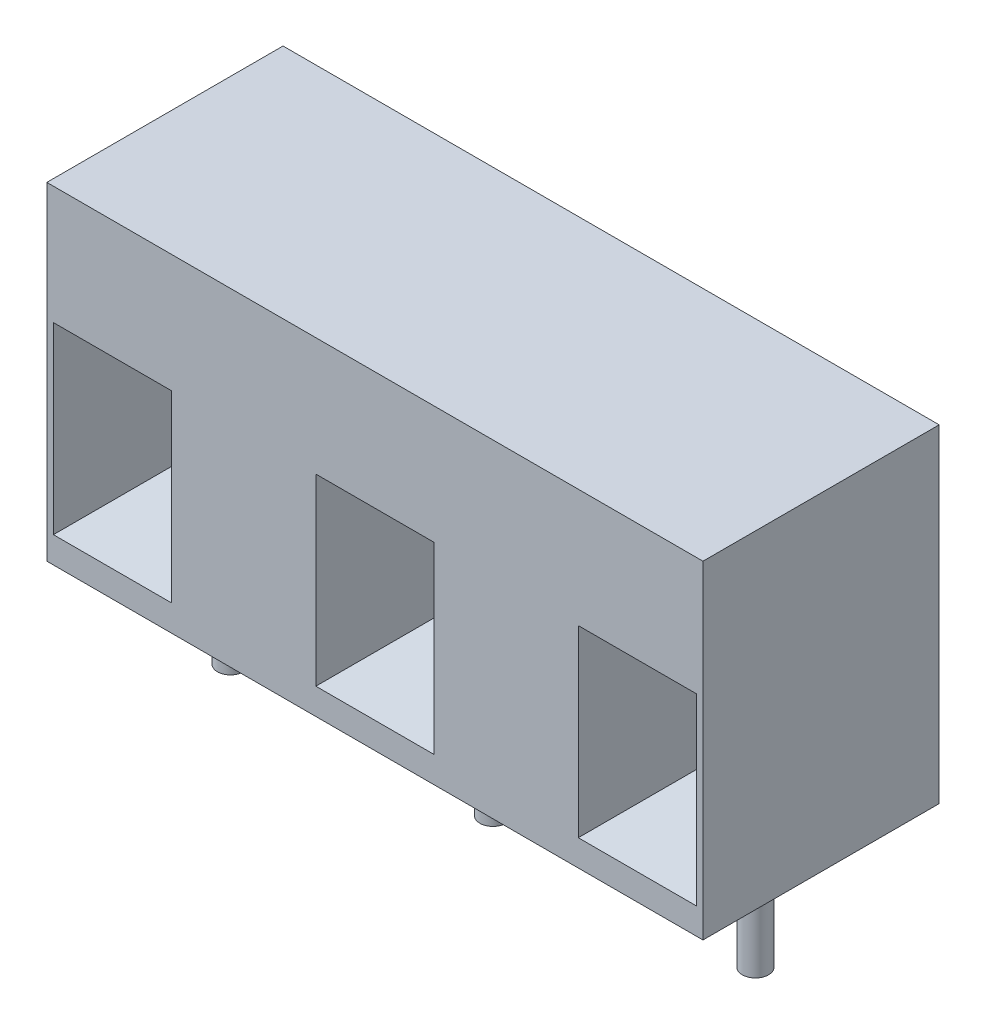
ISO-10303-21;
HEADER;
FILE_DESCRIPTION(('STEP AP214'),'2;1');
FILE_NAME('part.step','',(''),(''),'','','');
FILE_SCHEMA(('AUTOMOTIVE_DESIGN { 1 0 10303 214 1 1 1 1 }'));
ENDSEC;
DATA;
#1=APPLICATION_CONTEXT('core data for automotive mechanical design processes');
#2=APPLICATION_PROTOCOL_DEFINITION('international standard','automotive_design',2000,#1);
#3=PRODUCT_CONTEXT('',#1,'mechanical');
#4=PRODUCT('Part','Part','',(#3));
#5=PRODUCT_RELATED_PRODUCT_CATEGORY('part','',(#4));
#6=PRODUCT_DEFINITION_FORMATION('','',#4);
#7=PRODUCT_DEFINITION_CONTEXT('part definition',#1,'design');
#8=PRODUCT_DEFINITION('design','',#6,#7);
#9=PRODUCT_DEFINITION_SHAPE('','',#8);
#10=(LENGTH_UNIT() NAMED_UNIT(*) SI_UNIT(.MILLI.,.METRE.));
#11=(NAMED_UNIT(*) PLANE_ANGLE_UNIT() SI_UNIT($,.RADIAN.));
#12=(NAMED_UNIT(*) SI_UNIT($,.STERADIAN.) SOLID_ANGLE_UNIT());
#13=UNCERTAINTY_MEASURE_WITH_UNIT(LENGTH_MEASURE(1.E-05),#10,'distance_accuracy_value','');
#14=(GEOMETRIC_REPRESENTATION_CONTEXT(3) GLOBAL_UNCERTAINTY_ASSIGNED_CONTEXT((#13)) GLOBAL_UNIT_ASSIGNED_CONTEXT((#10,
#11,#12)) REPRESENTATION_CONTEXT('',''));
#15=CARTESIAN_POINT('',(0.,0.,0.));
#16=DIRECTION('',(0.,0.,1.));
#17=DIRECTION('',(1.,0.,0.));
#18=AXIS2_PLACEMENT_3D('',#15,#16,#17);
#19=CARTESIAN_POINT('',(12.5,12.5,4.5));
#20=DIRECTION('',(-1.,0.,0.));
#21=DIRECTION('',(0.,0.,1.));
#22=AXIS2_PLACEMENT_3D('',#19,#20,#21);
#23=PLANE('',#22);
#24=DIRECTION('',(0.,0.,-1.));
#25=VECTOR('',#24,1.);
#26=CARTESIAN_POINT('',(12.5,0.,4.5));
#27=LINE('',#26,#25);
#28=CARTESIAN_POINT('',(12.5,0.,4.5));
#29=VERTEX_POINT('',#28);
#30=CARTESIAN_POINT('',(12.5,0.,-4.5));
#31=VERTEX_POINT('',#30);
#32=EDGE_CURVE('E310',#29,#31,#27,.T.);
#33=ORIENTED_EDGE('',*,*,#32,.T.);
#34=DIRECTION('',(0.,-1.,0.));
#35=VECTOR('',#34,1.);
#36=CARTESIAN_POINT('',(12.5,12.5,-4.5));
#37=LINE('',#36,#35);
#38=CARTESIAN_POINT('',(12.5,12.5,-4.5));
#39=VERTEX_POINT('',#38);
#40=EDGE_CURVE('E11',#39,#31,#37,.T.);
#41=ORIENTED_EDGE('',*,*,#40,.F.);
#42=DIRECTION('',(0.,0.,-1.));
#43=VECTOR('',#42,1.);
#44=CARTESIAN_POINT('',(12.5,12.5,4.5));
#45=LINE('',#44,#43);
#46=CARTESIAN_POINT('',(12.5,12.5,4.5));
#47=VERTEX_POINT('',#46);
#48=EDGE_CURVE('E314',#47,#39,#45,.T.);
#49=ORIENTED_EDGE('',*,*,#48,.F.);
#50=DIRECTION('',(0.,-1.,0.));
#51=VECTOR('',#50,1.);
#52=CARTESIAN_POINT('',(12.5,12.5,4.5));
#53=LINE('',#52,#51);
#54=EDGE_CURVE('E328',#47,#29,#53,.T.);
#55=ORIENTED_EDGE('',*,*,#54,.T.);
#56=EDGE_LOOP('',(#33,#41,#49,#55));
#57=FACE_BOUND('',#56,.T.);
#58=ADVANCED_FACE('F39',(#57),#23,.F.);
#59=CARTESIAN_POINT('',(-12.5,12.5,-4.5));
#60=DIRECTION('',(0.,0.,1.));
#61=DIRECTION('',(1.,0.,0.));
#62=AXIS2_PLACEMENT_3D('',#59,#60,#61);
#63=PLANE('',#62);
#64=DIRECTION('',(-1.,0.,0.));
#65=VECTOR('',#64,1.);
#66=CARTESIAN_POINT('',(-12.5,0.,-4.5));
#67=LINE('',#66,#65);
#68=CARTESIAN_POINT('',(-12.5,0.,-4.5));
#69=VERTEX_POINT('',#68);
#70=EDGE_CURVE('E332',#31,#69,#67,.T.);
#71=ORIENTED_EDGE('',*,*,#70,.T.);
#72=DIRECTION('',(0.,-1.,0.));
#73=VECTOR('',#72,1.);
#74=CARTESIAN_POINT('',(-12.5,12.5,-4.5));
#75=LINE('',#74,#73);
#76=CARTESIAN_POINT('',(-12.5,12.5,-4.5));
#77=VERTEX_POINT('',#76);
#78=EDGE_CURVE('E47',#77,#69,#75,.T.);
#79=ORIENTED_EDGE('',*,*,#78,.F.);
#80=DIRECTION('',(-1.,0.,0.));
#81=VECTOR('',#80,1.);
#82=CARTESIAN_POINT('',(-12.5,12.5,-4.5));
#83=LINE('',#82,#81);
#84=EDGE_CURVE('E318',#39,#77,#83,.T.);
#85=ORIENTED_EDGE('',*,*,#84,.F.);
#86=ORIENTED_EDGE('',*,*,#40,.T.);
#87=EDGE_LOOP('',(#71,#79,#85,#86));
#88=FACE_BOUND('',#87,.T.);
#89=ADVANCED_FACE('F367',(#88),#63,.F.);
#90=CARTESIAN_POINT('',(-12.5,12.5,4.5));
#91=DIRECTION('',(1.,0.,0.));
#92=DIRECTION('',(0.,0.,-1.));
#93=AXIS2_PLACEMENT_3D('',#90,#91,#92);
#94=PLANE('',#93);
#95=DIRECTION('',(0.,0.,1.));
#96=VECTOR('',#95,1.);
#97=CARTESIAN_POINT('',(-12.5,0.,4.5));
#98=LINE('',#97,#96);
#99=CARTESIAN_POINT('',(-12.5,0.,4.5));
#100=VERTEX_POINT('',#99);
#101=EDGE_CURVE('E335',#69,#100,#98,.T.);
#102=ORIENTED_EDGE('',*,*,#101,.T.);
#103=DIRECTION('',(0.,-1.,0.));
#104=VECTOR('',#103,1.);
#105=CARTESIAN_POINT('',(-12.5,12.5,4.5));
#106=LINE('',#105,#104);
#107=CARTESIAN_POINT('',(-12.5,12.5,4.5));
#108=VERTEX_POINT('',#107);
#109=EDGE_CURVE('E343',#108,#100,#106,.T.);
#110=ORIENTED_EDGE('',*,*,#109,.F.);
#111=DIRECTION('',(0.,0.,1.));
#112=VECTOR('',#111,1.);
#113=CARTESIAN_POINT('',(-12.5,12.5,4.5));
#114=LINE('',#113,#112);
#115=EDGE_CURVE('E322',#77,#108,#114,.T.);
#116=ORIENTED_EDGE('',*,*,#115,.F.);
#117=ORIENTED_EDGE('',*,*,#78,.T.);
#118=EDGE_LOOP('',(#102,#110,#116,#117));
#119=FACE_BOUND('',#118,.T.);
#120=ADVANCED_FACE('F352',(#119),#94,.F.);
#121=CARTESIAN_POINT('',(-12.5,12.5,4.5));
#122=DIRECTION('',(0.,0.,-1.));
#123=DIRECTION('',(-1.,0.,0.));
#124=AXIS2_PLACEMENT_3D('',#121,#122,#123);
#125=PLANE('',#124);
#126=DIRECTION('',(-1.,0.,0.));
#127=VECTOR('',#126,1.);
#128=CARTESIAN_POINT('',(-12.25,8.,4.5));
#129=LINE('',#128,#127);
#130=CARTESIAN_POINT('',(-7.75,8.,4.5));
#131=VERTEX_POINT('',#130);
#132=CARTESIAN_POINT('',(-12.25,8.,4.5));
#133=VERTEX_POINT('',#132);
#134=EDGE_CURVE('E206',#131,#133,#129,.T.);
#135=ORIENTED_EDGE('',*,*,#134,.F.);
#136=DIRECTION('',(0.,1.,0.));
#137=VECTOR('',#136,1.);
#138=CARTESIAN_POINT('',(-7.75,1.,4.5));
#139=LINE('',#138,#137);
#140=CARTESIAN_POINT('',(-7.75,1.,4.5));
#141=VERTEX_POINT('',#140);
#142=EDGE_CURVE('E54',#141,#131,#139,.T.);
#143=ORIENTED_EDGE('',*,*,#142,.F.);
#144=DIRECTION('',(1.,0.,0.));
#145=VECTOR('',#144,1.);
#146=CARTESIAN_POINT('',(-12.25,1.,4.5));
#147=LINE('',#146,#145);
#148=CARTESIAN_POINT('',(-12.25,1.,4.5));
#149=VERTEX_POINT('',#148);
#150=EDGE_CURVE('E214',#149,#141,#147,.T.);
#151=ORIENTED_EDGE('',*,*,#150,.F.);
#152=DIRECTION('',(0.,-1.,0.));
#153=VECTOR('',#152,1.);
#154=CARTESIAN_POINT('',(-12.25,1.,4.5));
#155=LINE('',#154,#153);
#156=EDGE_CURVE('E210',#133,#149,#155,.T.);
#157=ORIENTED_EDGE('',*,*,#156,.F.);
#158=EDGE_LOOP('',(#135,#143,#151,#157));
#159=FACE_BOUND('',#158,.T.);
#160=DIRECTION('',(-1.,0.,0.));
#161=VECTOR('',#160,1.);
#162=CARTESIAN_POINT('',(7.75,8.,4.5));
#163=LINE('',#162,#161);
#164=CARTESIAN_POINT('',(12.25,8.,4.5));
#165=VERTEX_POINT('',#164);
#166=CARTESIAN_POINT('',(7.75,8.,4.5));
#167=VERTEX_POINT('',#166);
#168=EDGE_CURVE('E168',#165,#167,#163,.T.);
#169=ORIENTED_EDGE('',*,*,#168,.F.);
#170=DIRECTION('',(0.,1.,0.));
#171=VECTOR('',#170,1.);
#172=CARTESIAN_POINT('',(12.25,0.999999999999998,4.5));
#173=LINE('',#172,#171);
#174=CARTESIAN_POINT('',(12.25,0.999999999999998,4.5));
#175=VERTEX_POINT('',#174);
#176=EDGE_CURVE('E62',#175,#165,#173,.T.);
#177=ORIENTED_EDGE('',*,*,#176,.F.);
#178=DIRECTION('',(1.,0.,0.));
#179=VECTOR('',#178,1.);
#180=CARTESIAN_POINT('',(7.75,0.999999999999998,4.5));
#181=LINE('',#180,#179);
#182=CARTESIAN_POINT('',(7.75,0.999999999999998,4.5));
#183=VERTEX_POINT('',#182);
#184=EDGE_CURVE('E176',#183,#175,#181,.T.);
#185=ORIENTED_EDGE('',*,*,#184,.F.);
#186=DIRECTION('',(0.,-1.,0.));
#187=VECTOR('',#186,1.);
#188=CARTESIAN_POINT('',(7.75,0.999999999999998,4.5));
#189=LINE('',#188,#187);
#190=EDGE_CURVE('E156',#167,#183,#189,.T.);
#191=ORIENTED_EDGE('',*,*,#190,.F.);
#192=EDGE_LOOP('',(#169,#177,#185,#191));
#193=FACE_BOUND('',#192,.T.);
#194=DIRECTION('',(-1.,0.,0.));
#195=VECTOR('',#194,1.);
#196=CARTESIAN_POINT('',(-2.25000000000001,8.,4.5));
#197=LINE('',#196,#195);
#198=CARTESIAN_POINT('',(2.24999999999999,8.,4.5));
#199=VERTEX_POINT('',#198);
#200=CARTESIAN_POINT('',(-2.25000000000001,8.,4.5));
#201=VERTEX_POINT('',#200);
#202=EDGE_CURVE('E248',#199,#201,#197,.T.);
#203=ORIENTED_EDGE('',*,*,#202,.F.);
#204=DIRECTION('',(0.,1.,0.));
#205=VECTOR('',#204,1.);
#206=CARTESIAN_POINT('',(2.24999999999999,0.999999999999999,4.5));
#207=LINE('',#206,#205);
#208=CARTESIAN_POINT('',(2.24999999999999,0.999999999999999,4.5));
#209=VERTEX_POINT('',#208);
#210=EDGE_CURVE('E187',#209,#199,#207,.T.);
#211=ORIENTED_EDGE('',*,*,#210,.F.);
#212=DIRECTION('',(1.,0.,0.));
#213=VECTOR('',#212,1.);
#214=CARTESIAN_POINT('',(-2.25,0.999999999999999,4.5));
#215=LINE('',#214,#213);
#216=CARTESIAN_POINT('',(-2.25,0.999999999999999,4.5));
#217=VERTEX_POINT('',#216);
#218=EDGE_CURVE('E256',#217,#209,#215,.T.);
#219=ORIENTED_EDGE('',*,*,#218,.F.);
#220=DIRECTION('',(0.,-1.,0.));
#221=VECTOR('',#220,1.);
#222=CARTESIAN_POINT('',(-2.25,0.999999999999999,4.5));
#223=LINE('',#222,#221);
#224=EDGE_CURVE('E252',#201,#217,#223,.T.);
#225=ORIENTED_EDGE('',*,*,#224,.F.);
#226=EDGE_LOOP('',(#203,#211,#219,#225));
#227=FACE_BOUND('',#226,.T.);
#228=DIRECTION('',(1.,0.,0.));
#229=VECTOR('',#228,1.);
#230=CARTESIAN_POINT('',(-12.5,0.,4.5));
#231=LINE('',#230,#229);
#232=EDGE_CURVE('E319',#100,#29,#231,.T.);
#233=ORIENTED_EDGE('',*,*,#232,.T.);
#234=ORIENTED_EDGE('',*,*,#54,.F.);
#235=DIRECTION('',(1.,0.,0.));
#236=VECTOR('',#235,1.);
#237=CARTESIAN_POINT('',(-12.5,12.5,4.5));
#238=LINE('',#237,#236);
#239=EDGE_CURVE('E325',#108,#47,#238,.T.);
#240=ORIENTED_EDGE('',*,*,#239,.F.);
#241=ORIENTED_EDGE('',*,*,#109,.T.);
#242=EDGE_LOOP('',(#233,#234,#240,#241));
#243=FACE_BOUND('',#242,.T.);
#244=ADVANCED_FACE('F173',(#159,#193,#227,#243),#125,.F.);
#245=CARTESIAN_POINT('',(0.,12.5,0.));
#246=DIRECTION('',(0.,-1.,0.));
#247=DIRECTION('',(0.,0.,-1.));
#248=AXIS2_PLACEMENT_3D('',#245,#246,#247);
#249=PLANE('',#248);
#250=ORIENTED_EDGE('',*,*,#48,.T.);
#251=ORIENTED_EDGE('',*,*,#84,.T.);
#252=ORIENTED_EDGE('',*,*,#115,.T.);
#253=ORIENTED_EDGE('',*,*,#239,.T.);
#254=EDGE_LOOP('',(#250,#251,#252,#253));
#255=FACE_BOUND('',#254,.T.);
#256=ADVANCED_FACE('F366',(#255),#249,.F.);
#257=CARTESIAN_POINT('',(0.,0.,0.));
#258=DIRECTION('',(0.,-1.,0.));
#259=DIRECTION('',(0.,0.,-1.));
#260=AXIS2_PLACEMENT_3D('',#257,#258,#259);
#261=PLANE('',#260);
#262=CARTESIAN_POINT('',(10.,0.,0.));
#263=DIRECTION('',(0.,-1.,0.));
#264=DIRECTION('',(0.,0.,-1.));
#265=AXIS2_PLACEMENT_3D('',#262,#263,#264);
#266=CIRCLE('',#265,0.500000000000001);
#267=CARTESIAN_POINT('',(10.,0.,-0.500000000000001));
#268=VERTEX_POINT('',#267);
#269=EDGE_CURVE('E264',#268,#268,#266,.T.);
#270=ORIENTED_EDGE('',*,*,#269,.F.);
#271=EDGE_LOOP('',(#270));
#272=FACE_BOUND('',#271,.T.);
#273=CARTESIAN_POINT('',(-10.,0.,0.));
#274=DIRECTION('',(0.,-1.,0.));
#275=DIRECTION('',(0.,0.,-1.));
#276=AXIS2_PLACEMENT_3D('',#273,#274,#275);
#277=CIRCLE('',#276,0.500000000000001);
#278=CARTESIAN_POINT('',(-10.,0.,-0.500000000000001));
#279=VERTEX_POINT('',#278);
#280=EDGE_CURVE('E294',#279,#279,#277,.T.);
#281=ORIENTED_EDGE('',*,*,#280,.F.);
#282=EDGE_LOOP('',(#281));
#283=FACE_BOUND('',#282,.T.);
#284=CARTESIAN_POINT('',(0.,0.,0.));
#285=DIRECTION('',(0.,-1.,0.));
#286=DIRECTION('',(0.,0.,-1.));
#287=AXIS2_PLACEMENT_3D('',#284,#285,#286);
#288=CIRCLE('',#287,0.5);
#289=CARTESIAN_POINT('',(0.,0.,-0.5));
#290=VERTEX_POINT('',#289);
#291=EDGE_CURVE('E302',#290,#290,#288,.T.);
#292=ORIENTED_EDGE('',*,*,#291,.F.);
#293=EDGE_LOOP('',(#292));
#294=FACE_BOUND('',#293,.T.);
#295=ORIENTED_EDGE('',*,*,#32,.F.);
#296=ORIENTED_EDGE('',*,*,#232,.F.);
#297=ORIENTED_EDGE('',*,*,#101,.F.);
#298=ORIENTED_EDGE('',*,*,#70,.F.);
#299=EDGE_LOOP('',(#295,#296,#297,#298));
#300=FACE_BOUND('',#299,.T.);
#301=ADVANCED_FACE('F358',(#272,#283,#294,#300),#261,.T.);
#302=CARTESIAN_POINT('',(0.,-4.4,0.));
#303=DIRECTION('',(0.,1.,0.));
#304=DIRECTION('',(0.,0.,1.));
#305=AXIS2_PLACEMENT_3D('',#302,#303,#304);
#306=CYLINDRICAL_SURFACE('',#305,0.5);
#307=CARTESIAN_POINT('',(0.,-4.4,0.));
#308=DIRECTION('',(0.,-1.,0.));
#309=DIRECTION('',(0.,0.,-1.));
#310=AXIS2_PLACEMENT_3D('',#307,#308,#309);
#311=CIRCLE('',#310,0.5);
#312=CARTESIAN_POINT('',(0.,-4.4,-0.5));
#313=VERTEX_POINT('',#312);
#314=EDGE_CURVE('E306',#313,#313,#311,.T.);
#315=ORIENTED_EDGE('',*,*,#314,.F.);
#316=EDGE_LOOP('',(#315));
#317=FACE_BOUND('',#316,.T.);
#318=ORIENTED_EDGE('',*,*,#291,.T.);
#319=EDGE_LOOP('',(#318));
#320=FACE_BOUND('',#319,.T.);
#321=ADVANCED_FACE('F380',(#317,#320),#306,.T.);
#322=CARTESIAN_POINT('',(0.,-4.4,0.));
#323=DIRECTION('',(0.,-1.,0.));
#324=DIRECTION('',(0.,0.,-1.));
#325=AXIS2_PLACEMENT_3D('',#322,#323,#324);
#326=PLANE('',#325);
#327=ORIENTED_EDGE('',*,*,#314,.T.);
#328=EDGE_LOOP('',(#327));
#329=FACE_BOUND('',#328,.T.);
#330=ADVANCED_FACE('F386',(#329),#326,.T.);
#331=CARTESIAN_POINT('',(-10.,-4.4,0.));
#332=DIRECTION('',(0.,1.,0.));
#333=DIRECTION('',(0.,0.,1.));
#334=AXIS2_PLACEMENT_3D('',#331,#332,#333);
#335=CYLINDRICAL_SURFACE('',#334,0.500000000000001);
#336=CARTESIAN_POINT('',(-10.,-4.4,0.));
#337=DIRECTION('',(0.,-1.,0.));
#338=DIRECTION('',(0.,0.,-1.));
#339=AXIS2_PLACEMENT_3D('',#336,#337,#338);
#340=CIRCLE('',#339,0.500000000000001);
#341=CARTESIAN_POINT('',(-10.,-4.4,-0.500000000000001));
#342=VERTEX_POINT('',#341);
#343=EDGE_CURVE('E298',#342,#342,#340,.T.);
#344=ORIENTED_EDGE('',*,*,#343,.F.);
#345=EDGE_LOOP('',(#344));
#346=FACE_BOUND('',#345,.T.);
#347=ORIENTED_EDGE('',*,*,#280,.T.);
#348=EDGE_LOOP('',(#347));
#349=FACE_BOUND('',#348,.T.);
#350=ADVANCED_FACE('F390',(#346,#349),#335,.T.);
#351=CARTESIAN_POINT('',(-10.,-4.4,0.));
#352=DIRECTION('',(0.,-1.,0.));
#353=DIRECTION('',(0.,0.,-1.));
#354=AXIS2_PLACEMENT_3D('',#351,#352,#353);
#355=PLANE('',#354);
#356=ORIENTED_EDGE('',*,*,#343,.T.);
#357=EDGE_LOOP('',(#356));
#358=FACE_BOUND('',#357,.T.);
#359=ADVANCED_FACE('F394',(#358),#355,.T.);
#360=CARTESIAN_POINT('',(10.,-4.4,0.));
#361=DIRECTION('',(0.,1.,0.));
#362=DIRECTION('',(0.,0.,1.));
#363=AXIS2_PLACEMENT_3D('',#360,#361,#362);
#364=CYLINDRICAL_SURFACE('',#363,0.500000000000001);
#365=CARTESIAN_POINT('',(10.,-4.4,0.));
#366=DIRECTION('',(0.,-1.,0.));
#367=DIRECTION('',(0.,0.,-1.));
#368=AXIS2_PLACEMENT_3D('',#365,#366,#367);
#369=CIRCLE('',#368,0.500000000000001);
#370=CARTESIAN_POINT('',(10.,-4.4,-0.500000000000001));
#371=VERTEX_POINT('',#370);
#372=EDGE_CURVE('E290',#371,#371,#369,.T.);
#373=ORIENTED_EDGE('',*,*,#372,.F.);
#374=EDGE_LOOP('',(#373));
#375=FACE_BOUND('',#374,.T.);
#376=ORIENTED_EDGE('',*,*,#269,.T.);
#377=EDGE_LOOP('',(#376));
#378=FACE_BOUND('',#377,.T.);
#379=ADVANCED_FACE('F398',(#375,#378),#364,.T.);
#380=CARTESIAN_POINT('',(10.,-4.4,0.));
#381=DIRECTION('',(0.,-1.,0.));
#382=DIRECTION('',(0.,0.,-1.));
#383=AXIS2_PLACEMENT_3D('',#380,#381,#382);
#384=PLANE('',#383);
#385=ORIENTED_EDGE('',*,*,#372,.T.);
#386=EDGE_LOOP('',(#385));
#387=FACE_BOUND('',#386,.T.);
#388=ADVANCED_FACE('F402',(#387),#384,.T.);
#389=CARTESIAN_POINT('',(2.24999999999999,0.999999999999999,4.5));
#390=DIRECTION('',(0.965925826289068,0.,-0.258819045102521));
#391=DIRECTION('',(-0.258819045102521,0.,-0.965925826289068));
#392=AXIS2_PLACEMENT_3D('',#389,#390,#391);
#393=PLANE('',#392);
#394=ORIENTED_EDGE('',*,*,#210,.T.);
#395=DIRECTION('',(0.250562807085732,0.250562807085732,0.935113126531029));
#396=VECTOR('',#395,1.);
#397=CARTESIAN_POINT('',(1.81052795793722,7.56052795793723,2.85986801051569));
#398=LINE('',#397,#396);
#399=CARTESIAN_POINT('',(1.07102355330305,6.82102355330306,0.1));
#400=VERTEX_POINT('',#399);
#401=EDGE_CURVE('E266',#400,#199,#398,.T.);
#402=ORIENTED_EDGE('',*,*,#401,.F.);
#403=DIRECTION('',(0.,1.,0.));
#404=VECTOR('',#403,1.);
#405=CARTESIAN_POINT('',(1.07102355330305,0.999999999999999,0.1));
#406=LINE('',#405,#404);
#407=CARTESIAN_POINT('',(1.07102355330305,2.17897644669694,0.1));
#408=VERTEX_POINT('',#407);
#409=EDGE_CURVE('E260',#408,#400,#406,.T.);
#410=ORIENTED_EDGE('',*,*,#409,.F.);
#411=DIRECTION('',(0.250562807085732,-0.250562807085732,0.935113126531029));
#412=VECTOR('',#411,1.);
#413=CARTESIAN_POINT('',(1.96748225867393,1.28251774132607,3.44562943533152));
#414=LINE('',#413,#412);
#415=EDGE_CURVE('E261',#408,#209,#414,.T.);
#416=ORIENTED_EDGE('',*,*,#415,.T.);
#417=EDGE_LOOP('',(#394,#402,#410,#416));
#418=FACE_BOUND('',#417,.T.);
#419=ADVANCED_FACE('F406',(#418),#393,.F.);
#420=CARTESIAN_POINT('',(-2.25,0.999999999999999,4.5));
#421=DIRECTION('',(0.,-0.965925826289068,-0.258819045102521));
#422=DIRECTION('',(0.,0.258819045102521,-0.965925826289068));
#423=AXIS2_PLACEMENT_3D('',#420,#421,#422);
#424=PLANE('',#423);
#425=ORIENTED_EDGE('',*,*,#218,.T.);
#426=ORIENTED_EDGE('',*,*,#415,.F.);
#427=DIRECTION('',(1.,0.,0.));
#428=VECTOR('',#427,1.);
#429=CARTESIAN_POINT('',(-2.25,2.17897644669694,0.1));
#430=LINE('',#429,#428);
#431=CARTESIAN_POINT('',(-1.07102355330306,2.17897644669694,0.1));
#432=VERTEX_POINT('',#431);
#433=EDGE_CURVE('E271',#432,#408,#430,.T.);
#434=ORIENTED_EDGE('',*,*,#433,.F.);
#435=DIRECTION('',(-0.250562807085732,-0.250562807085732,0.935113126531029));
#436=VECTOR('',#435,1.);
#437=CARTESIAN_POINT('',(-2.25,0.999999999999999,4.5));
#438=LINE('',#437,#436);
#439=EDGE_CURVE('E265',#432,#217,#438,.T.);
#440=ORIENTED_EDGE('',*,*,#439,.T.);
#441=EDGE_LOOP('',(#425,#426,#434,#440));
#442=FACE_BOUND('',#441,.T.);
#443=ADVANCED_FACE('F408',(#442),#424,.F.);
#444=CARTESIAN_POINT('',(-2.25,0.999999999999999,4.5));
#445=DIRECTION('',(-0.965925826289068,0.,-0.258819045102521));
#446=DIRECTION('',(-0.258819045102521,0.,0.965925826289068));
#447=AXIS2_PLACEMENT_3D('',#444,#445,#446);
#448=PLANE('',#447);
#449=ORIENTED_EDGE('',*,*,#224,.T.);
#450=ORIENTED_EDGE('',*,*,#439,.F.);
#451=DIRECTION('',(0.,-1.,0.));
#452=VECTOR('',#451,1.);
#453=CARTESIAN_POINT('',(-1.07102355330306,0.999999999999999,0.1));
#454=LINE('',#453,#452);
#455=CARTESIAN_POINT('',(-1.07102355330306,6.82102355330306,0.1));
#456=VERTEX_POINT('',#455);
#457=EDGE_CURVE('E283',#456,#432,#454,.T.);
#458=ORIENTED_EDGE('',*,*,#457,.F.);
#459=DIRECTION('',(-0.250562807085732,0.250562807085732,0.935113126531029));
#460=VECTOR('',#459,1.);
#461=CARTESIAN_POINT('',(-2.25000000000001,8.,4.5));
#462=LINE('',#461,#460);
#463=EDGE_CURVE('E270',#456,#201,#462,.T.);
#464=ORIENTED_EDGE('',*,*,#463,.T.);
#465=EDGE_LOOP('',(#449,#450,#458,#464));
#466=FACE_BOUND('',#465,.T.);
#467=ADVANCED_FACE('F411',(#466),#448,.F.);
#468=CARTESIAN_POINT('',(-2.25000000000001,8.,4.5));
#469=DIRECTION('',(0.,0.965925826289068,-0.258819045102521));
#470=DIRECTION('',(0.,0.258819045102521,0.965925826289068));
#471=AXIS2_PLACEMENT_3D('',#468,#469,#470);
#472=PLANE('',#471);
#473=ORIENTED_EDGE('',*,*,#202,.T.);
#474=ORIENTED_EDGE('',*,*,#463,.F.);
#475=DIRECTION('',(-1.,0.,0.));
#476=VECTOR('',#475,1.);
#477=CARTESIAN_POINT('',(-2.25000000000001,6.82102355330306,0.1));
#478=LINE('',#477,#476);
#479=EDGE_CURVE('E279',#400,#456,#478,.T.);
#480=ORIENTED_EDGE('',*,*,#479,.F.);
#481=ORIENTED_EDGE('',*,*,#401,.T.);
#482=EDGE_LOOP('',(#473,#474,#480,#481));
#483=FACE_BOUND('',#482,.T.);
#484=ADVANCED_FACE('F415',(#483),#472,.F.);
#485=CARTESIAN_POINT('',(0.,0.,0.1));
#486=DIRECTION('',(0.,0.,-1.));
#487=DIRECTION('',(-1.,0.,0.));
#488=AXIS2_PLACEMENT_3D('',#485,#486,#487);
#489=PLANE('',#488);
#490=ORIENTED_EDGE('',*,*,#409,.T.);
#491=ORIENTED_EDGE('',*,*,#479,.T.);
#492=ORIENTED_EDGE('',*,*,#457,.T.);
#493=ORIENTED_EDGE('',*,*,#433,.T.);
#494=EDGE_LOOP('',(#490,#491,#492,#493));
#495=FACE_BOUND('',#494,.T.);
#496=ADVANCED_FACE('F419',(#495),#489,.F.);
#497=CARTESIAN_POINT('',(12.25,0.999999999999998,4.5));
#498=DIRECTION('',(0.965925826289068,0.,-0.258819045102521));
#499=DIRECTION('',(-0.258819045102521,0.,-0.965925826289068));
#500=AXIS2_PLACEMENT_3D('',#497,#498,#499);
#501=PLANE('',#500);
#502=ORIENTED_EDGE('',*,*,#176,.T.);
#503=DIRECTION('',(0.250562807085732,0.250562807085732,0.935113126531029));
#504=VECTOR('',#503,1.);
#505=CARTESIAN_POINT('',(11.8105279579372,7.56052795793723,2.85986801051569));
#506=LINE('',#505,#504);
#507=CARTESIAN_POINT('',(11.0710235533031,6.82102355330306,0.1));
#508=VERTEX_POINT('',#507);
#509=EDGE_CURVE('E165',#508,#165,#506,.T.);
#510=ORIENTED_EDGE('',*,*,#509,.F.);
#511=DIRECTION('',(0.,1.,0.));
#512=VECTOR('',#511,1.);
#513=CARTESIAN_POINT('',(11.0710235533031,0.999999999999998,0.1));
#514=LINE('',#513,#512);
#515=CARTESIAN_POINT('',(11.0710235533031,2.17897644669694,0.1));
#516=VERTEX_POINT('',#515);
#517=EDGE_CURVE('E180',#516,#508,#514,.T.);
#518=ORIENTED_EDGE('',*,*,#517,.F.);
#519=DIRECTION('',(0.250562807085732,-0.250562807085732,0.935113126531029));
#520=VECTOR('',#519,1.);
#521=CARTESIAN_POINT('',(11.9674822586739,1.28251774132607,3.44562943533152));
#522=LINE('',#521,#520);
#523=EDGE_CURVE('E184',#516,#175,#522,.T.);
#524=ORIENTED_EDGE('',*,*,#523,.T.);
#525=EDGE_LOOP('',(#502,#510,#518,#524));
#526=FACE_BOUND('',#525,.T.);
#527=ADVANCED_FACE('F426',(#526),#501,.F.);
#528=CARTESIAN_POINT('',(7.75,0.999999999999998,4.5));
#529=DIRECTION('',(0.,-0.965925826289068,-0.258819045102521));
#530=DIRECTION('',(0.,0.258819045102521,-0.965925826289068));
#531=AXIS2_PLACEMENT_3D('',#528,#529,#530);
#532=PLANE('',#531);
#533=ORIENTED_EDGE('',*,*,#184,.T.);
#534=ORIENTED_EDGE('',*,*,#523,.F.);
#535=DIRECTION('',(1.,0.,0.));
#536=VECTOR('',#535,1.);
#537=CARTESIAN_POINT('',(7.75,2.17897644669694,0.1));
#538=LINE('',#537,#536);
#539=CARTESIAN_POINT('',(8.92897644669694,2.17897644669694,0.1));
#540=VERTEX_POINT('',#539);
#541=EDGE_CURVE('E189',#540,#516,#538,.T.);
#542=ORIENTED_EDGE('',*,*,#541,.F.);
#543=DIRECTION('',(-0.250562807085732,-0.250562807085732,0.935113126531029));
#544=VECTOR('',#543,1.);
#545=CARTESIAN_POINT('',(7.75,0.999999999999998,4.5));
#546=LINE('',#545,#544);
#547=EDGE_CURVE('E164',#540,#183,#546,.T.);
#548=ORIENTED_EDGE('',*,*,#547,.T.);
#549=EDGE_LOOP('',(#533,#534,#542,#548));
#550=FACE_BOUND('',#549,.T.);
#551=ADVANCED_FACE('F448',(#550),#532,.F.);
#552=CARTESIAN_POINT('',(7.75,0.999999999999998,4.5));
#553=DIRECTION('',(-0.965925826289068,0.,-0.258819045102521));
#554=DIRECTION('',(-0.258819045102521,0.,0.965925826289068));
#555=AXIS2_PLACEMENT_3D('',#552,#553,#554);
#556=PLANE('',#555);
#557=ORIENTED_EDGE('',*,*,#190,.T.);
#558=ORIENTED_EDGE('',*,*,#547,.F.);
#559=DIRECTION('',(0.,-1.,0.));
#560=VECTOR('',#559,1.);
#561=CARTESIAN_POINT('',(8.92897644669694,0.999999999999999,0.1));
#562=LINE('',#561,#560);
#563=CARTESIAN_POINT('',(8.92897644669694,6.82102355330306,0.1));
#564=VERTEX_POINT('',#563);
#565=EDGE_CURVE('E159',#564,#540,#562,.T.);
#566=ORIENTED_EDGE('',*,*,#565,.F.);
#567=DIRECTION('',(-0.250562807085732,0.250562807085732,0.935113126531029));
#568=VECTOR('',#567,1.);
#569=CARTESIAN_POINT('',(7.75,8.,4.5));
#570=LINE('',#569,#568);
#571=EDGE_CURVE('E152',#564,#167,#570,.T.);
#572=ORIENTED_EDGE('',*,*,#571,.T.);
#573=EDGE_LOOP('',(#557,#558,#566,#572));
#574=FACE_BOUND('',#573,.T.);
#575=ADVANCED_FACE('F154',(#574),#556,.F.);
#576=CARTESIAN_POINT('',(7.75,8.,4.5));
#577=DIRECTION('',(0.,0.965925826289068,-0.258819045102521));
#578=DIRECTION('',(0.,0.258819045102521,0.965925826289068));
#579=AXIS2_PLACEMENT_3D('',#576,#577,#578);
#580=PLANE('',#579);
#581=ORIENTED_EDGE('',*,*,#168,.T.);
#582=ORIENTED_EDGE('',*,*,#571,.F.);
#583=DIRECTION('',(-1.,0.,0.));
#584=VECTOR('',#583,1.);
#585=CARTESIAN_POINT('',(7.75,6.82102355330306,0.1));
#586=LINE('',#585,#584);
#587=EDGE_CURVE('E196',#508,#564,#586,.T.);
#588=ORIENTED_EDGE('',*,*,#587,.F.);
#589=ORIENTED_EDGE('',*,*,#509,.T.);
#590=EDGE_LOOP('',(#581,#582,#588,#589));
#591=FACE_BOUND('',#590,.T.);
#592=ADVANCED_FACE('F169',(#591),#580,.F.);
#593=CARTESIAN_POINT('',(0.,0.,0.1));
#594=DIRECTION('',(0.,0.,-1.));
#595=DIRECTION('',(-1.,0.,0.));
#596=AXIS2_PLACEMENT_3D('',#593,#594,#595);
#597=PLANE('',#596);
#598=ORIENTED_EDGE('',*,*,#517,.T.);
#599=ORIENTED_EDGE('',*,*,#587,.T.);
#600=ORIENTED_EDGE('',*,*,#565,.T.);
#601=ORIENTED_EDGE('',*,*,#541,.T.);
#602=EDGE_LOOP('',(#598,#599,#600,#601));
#603=FACE_BOUND('',#602,.T.);
#604=ADVANCED_FACE('F444',(#603),#597,.F.);
#605=CARTESIAN_POINT('',(-7.75,1.,4.5));
#606=DIRECTION('',(0.965925826289068,0.,-0.258819045102521));
#607=DIRECTION('',(-0.258819045102521,0.,-0.965925826289068));
#608=AXIS2_PLACEMENT_3D('',#605,#606,#607);
#609=PLANE('',#608);
#610=ORIENTED_EDGE('',*,*,#142,.T.);
#611=DIRECTION('',(0.250562807085732,0.250562807085732,0.935113126531029));
#612=VECTOR('',#611,1.);
#613=CARTESIAN_POINT('',(-8.18947204206277,7.56052795793723,2.85986801051569));
#614=LINE('',#613,#612);
#615=CARTESIAN_POINT('',(-8.92897644669694,6.82102355330306,0.1));
#616=VERTEX_POINT('',#615);
#617=EDGE_CURVE('E223',#616,#131,#614,.T.);
#618=ORIENTED_EDGE('',*,*,#617,.F.);
#619=DIRECTION('',(0.,1.,0.));
#620=VECTOR('',#619,1.);
#621=CARTESIAN_POINT('',(-8.92897644669694,1.,0.1));
#622=LINE('',#621,#620);
#623=CARTESIAN_POINT('',(-8.92897644669694,2.17897644669694,0.1));
#624=VERTEX_POINT('',#623);
#625=EDGE_CURVE('E218',#624,#616,#622,.T.);
#626=ORIENTED_EDGE('',*,*,#625,.F.);
#627=DIRECTION('',(0.250562807085732,-0.250562807085732,0.935113126531029));
#628=VECTOR('',#627,1.);
#629=CARTESIAN_POINT('',(-8.03251774132607,1.28251774132607,3.44562943533151));
#630=LINE('',#629,#628);
#631=EDGE_CURVE('E219',#624,#141,#630,.T.);
#632=ORIENTED_EDGE('',*,*,#631,.T.);
#633=EDGE_LOOP('',(#610,#618,#626,#632));
#634=FACE_BOUND('',#633,.T.);
#635=ADVANCED_FACE('F432',(#634),#609,.F.);
#636=CARTESIAN_POINT('',(-12.25,1.,4.5));
#637=DIRECTION('',(0.,-0.965925826289068,-0.258819045102521));
#638=DIRECTION('',(0.,0.258819045102521,-0.965925826289068));
#639=AXIS2_PLACEMENT_3D('',#636,#637,#638);
#640=PLANE('',#639);
#641=ORIENTED_EDGE('',*,*,#150,.T.);
#642=ORIENTED_EDGE('',*,*,#631,.F.);
#643=DIRECTION('',(1.,0.,0.));
#644=VECTOR('',#643,1.);
#645=CARTESIAN_POINT('',(-12.25,2.17897644669694,0.1));
#646=LINE('',#645,#644);
#647=CARTESIAN_POINT('',(-11.0710235533031,2.17897644669694,0.1));
#648=VERTEX_POINT('',#647);
#649=EDGE_CURVE('E227',#648,#624,#646,.T.);
#650=ORIENTED_EDGE('',*,*,#649,.F.);
#651=DIRECTION('',(-0.250562807085732,-0.250562807085732,0.935113126531029));
#652=VECTOR('',#651,1.);
#653=CARTESIAN_POINT('',(-12.25,1.,4.5));
#654=LINE('',#653,#652);
#655=EDGE_CURVE('E222',#648,#149,#654,.T.);
#656=ORIENTED_EDGE('',*,*,#655,.T.);
#657=EDGE_LOOP('',(#641,#642,#650,#656));
#658=FACE_BOUND('',#657,.T.);
#659=ADVANCED_FACE('F428',(#658),#640,.F.);
#660=CARTESIAN_POINT('',(-12.25,1.,4.5));
#661=DIRECTION('',(-0.965925826289068,0.,-0.258819045102521));
#662=DIRECTION('',(-0.258819045102521,0.,0.965925826289068));
#663=AXIS2_PLACEMENT_3D('',#660,#661,#662);
#664=PLANE('',#663);
#665=ORIENTED_EDGE('',*,*,#156,.T.);
#666=ORIENTED_EDGE('',*,*,#655,.F.);
#667=DIRECTION('',(0.,-1.,0.));
#668=VECTOR('',#667,1.);
#669=CARTESIAN_POINT('',(-11.0710235533031,1.,0.1));
#670=LINE('',#669,#668);
#671=CARTESIAN_POINT('',(-11.0710235533031,6.82102355330306,0.1));
#672=VERTEX_POINT('',#671);
#673=EDGE_CURVE('E239',#672,#648,#670,.T.);
#674=ORIENTED_EDGE('',*,*,#673,.F.);
#675=DIRECTION('',(-0.250562807085732,0.250562807085732,0.935113126531029));
#676=VECTOR('',#675,1.);
#677=CARTESIAN_POINT('',(-12.25,8.,4.5));
#678=LINE('',#677,#676);
#679=EDGE_CURVE('E226',#672,#133,#678,.T.);
#680=ORIENTED_EDGE('',*,*,#679,.T.);
#681=EDGE_LOOP('',(#665,#666,#674,#680));
#682=FACE_BOUND('',#681,.T.);
#683=ADVANCED_FACE('F431',(#682),#664,.F.);
#684=CARTESIAN_POINT('',(-12.25,8.,4.5));
#685=DIRECTION('',(0.,0.965925826289068,-0.258819045102521));
#686=DIRECTION('',(0.,0.258819045102521,0.965925826289068));
#687=AXIS2_PLACEMENT_3D('',#684,#685,#686);
#688=PLANE('',#687);
#689=ORIENTED_EDGE('',*,*,#134,.T.);
#690=ORIENTED_EDGE('',*,*,#679,.F.);
#691=DIRECTION('',(-1.,0.,0.));
#692=VECTOR('',#691,1.);
#693=CARTESIAN_POINT('',(-12.25,6.82102355330306,0.1));
#694=LINE('',#693,#692);
#695=EDGE_CURVE('E235',#616,#672,#694,.T.);
#696=ORIENTED_EDGE('',*,*,#695,.F.);
#697=ORIENTED_EDGE('',*,*,#617,.T.);
#698=EDGE_LOOP('',(#689,#690,#696,#697));
#699=FACE_BOUND('',#698,.T.);
#700=ADVANCED_FACE('F436',(#699),#688,.F.);
#701=CARTESIAN_POINT('',(0.,0.,0.1));
#702=DIRECTION('',(0.,0.,-1.));
#703=DIRECTION('',(-1.,0.,0.));
#704=AXIS2_PLACEMENT_3D('',#701,#702,#703);
#705=PLANE('',#704);
#706=ORIENTED_EDGE('',*,*,#625,.T.);
#707=ORIENTED_EDGE('',*,*,#695,.T.);
#708=ORIENTED_EDGE('',*,*,#673,.T.);
#709=ORIENTED_EDGE('',*,*,#649,.T.);
#710=EDGE_LOOP('',(#706,#707,#708,#709));
#711=FACE_BOUND('',#710,.T.);
#712=ADVANCED_FACE('F440',(#711),#705,.F.);
#713=CLOSED_SHELL('',(#58,#89,#120,#244,#256,#301,#321,#330,#350,#359,#379,#388,#419,#443,#467,
#484,#496,#527,#551,#575,#592,#604,#635,#659,#683,#700,#712));
#714=MANIFOLD_SOLID_BREP('B2',#713);
#715=ADVANCED_BREP_SHAPE_REPRESENTATION('',(#18,#714),#14);
#716=SHAPE_DEFINITION_REPRESENTATION(#9,#715);
ENDSEC;
END-ISO-10303-21;
